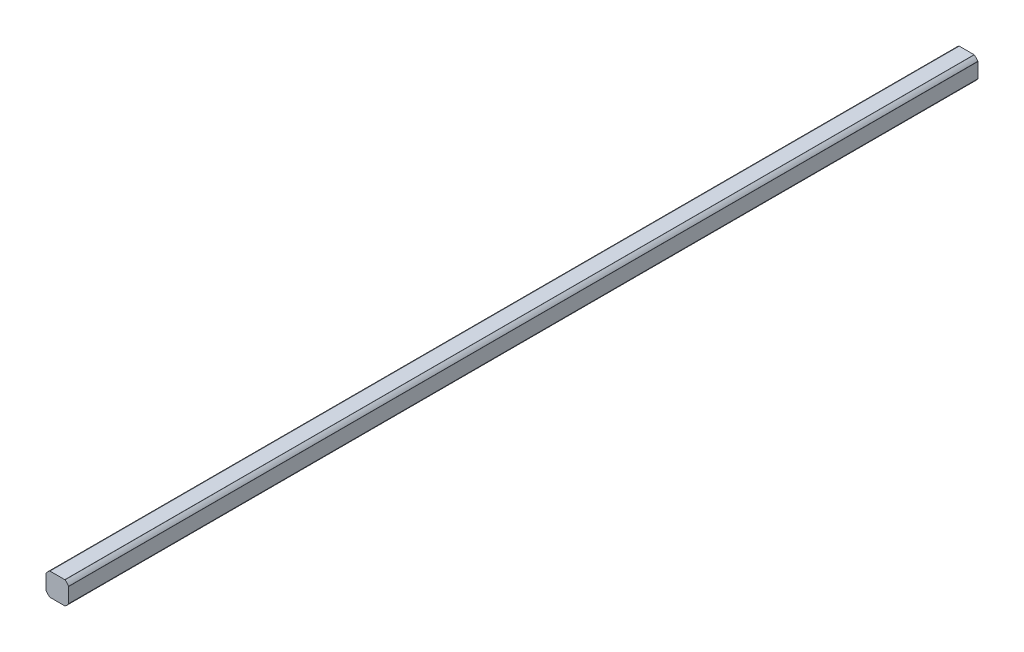
ISO-10303-21;
HEADER;
FILE_DESCRIPTION(('STEP AP214'),'2;1');
FILE_NAME('part.step','',(''),(''),'','','');
FILE_SCHEMA(('AUTOMOTIVE_DESIGN { 1 0 10303 214 1 1 1 1 }'));
ENDSEC;
DATA;
#1=APPLICATION_CONTEXT('core data for automotive mechanical design processes');
#2=APPLICATION_PROTOCOL_DEFINITION('international standard','automotive_design',2000,#1);
#3=PRODUCT_CONTEXT('',#1,'mechanical');
#4=PRODUCT('Part','Part','',(#3));
#5=PRODUCT_RELATED_PRODUCT_CATEGORY('part','',(#4));
#6=PRODUCT_DEFINITION_FORMATION('','',#4);
#7=PRODUCT_DEFINITION_CONTEXT('part definition',#1,'design');
#8=PRODUCT_DEFINITION('design','',#6,#7);
#9=PRODUCT_DEFINITION_SHAPE('','',#8);
#10=(LENGTH_UNIT() NAMED_UNIT(*) SI_UNIT(.MILLI.,.METRE.));
#11=(NAMED_UNIT(*) PLANE_ANGLE_UNIT() SI_UNIT($,.RADIAN.));
#12=(NAMED_UNIT(*) SI_UNIT($,.STERADIAN.) SOLID_ANGLE_UNIT());
#13=UNCERTAINTY_MEASURE_WITH_UNIT(LENGTH_MEASURE(1.E-05),#10,'distance_accuracy_value','');
#14=(GEOMETRIC_REPRESENTATION_CONTEXT(3) GLOBAL_UNCERTAINTY_ASSIGNED_CONTEXT((#13)) GLOBAL_UNIT_ASSIGNED_CONTEXT((#10,
#11,#12)) REPRESENTATION_CONTEXT('',''));
#15=CARTESIAN_POINT('',(0.,0.,0.));
#16=DIRECTION('',(0.,0.,1.));
#17=DIRECTION('',(1.,0.,0.));
#18=AXIS2_PLACEMENT_3D('',#15,#16,#17);
#19=CARTESIAN_POINT('',(0.,0.,304.8));
#20=DIRECTION('',(0.,0.,-1.));
#21=DIRECTION('',(-1.,0.,0.));
#22=AXIS2_PLACEMENT_3D('',#19,#20,#21);
#23=CYLINDRICAL_SURFACE('',#22,3.81);
#24=DIRECTION('',(0.,0.,1.));
#25=VECTOR('',#24,1.);
#26=CARTESIAN_POINT('',(3.15310344827586,-2.13870022314275,304.8));
#27=LINE('',#26,#25);
#28=CARTESIAN_POINT('',(3.15310344827586,-2.13870022314276,25.4));
#29=VERTEX_POINT('',#28);
#30=CARTESIAN_POINT('',(3.15310344827586,-2.13870022314276,279.4));
#31=VERTEX_POINT('',#30);
#32=EDGE_CURVE('E205',#29,#31,#27,.T.);
#33=ORIENTED_EDGE('',*,*,#32,.T.);
#34=CARTESIAN_POINT('',(0.,0.,279.4));
#35=DIRECTION('',(0.,0.,1.));
#36=DIRECTION('',(1.,0.,0.));
#37=AXIS2_PLACEMENT_3D('',#34,#35,#36);
#38=CIRCLE('',#37,3.81);
#39=CARTESIAN_POINT('',(2.13870022314276,-3.15310344827586,279.4));
#40=VERTEX_POINT('',#39);
#41=EDGE_CURVE('E180',#40,#31,#38,.T.);
#42=ORIENTED_EDGE('',*,*,#41,.F.);
#43=DIRECTION('',(0.,0.,-1.));
#44=VECTOR('',#43,1.);
#45=CARTESIAN_POINT('',(2.13870022314275,-3.15310344827586,304.8));
#46=LINE('',#45,#44);
#47=CARTESIAN_POINT('',(2.13870022314275,-3.15310344827586,25.4));
#48=VERTEX_POINT('',#47);
#49=EDGE_CURVE('E67',#40,#48,#46,.T.);
#50=ORIENTED_EDGE('',*,*,#49,.T.);
#51=CARTESIAN_POINT('',(0.,0.,25.4));
#52=DIRECTION('',(0.,0.,1.));
#53=DIRECTION('',(1.,0.,0.));
#54=AXIS2_PLACEMENT_3D('',#51,#52,#53);
#55=CIRCLE('',#54,3.81);
#56=EDGE_CURVE('E276',#48,#29,#55,.T.);
#57=ORIENTED_EDGE('',*,*,#56,.T.);
#58=EDGE_LOOP('',(#33,#42,#50,#57));
#59=FACE_BOUND('',#58,.T.);
#60=ADVANCED_FACE('F42',(#59),#23,.T.);
#61=CARTESIAN_POINT('',(3.175,2.10605674187568,304.8));
#62=DIRECTION('',(-1.,0.,0.));
#63=DIRECTION('',(0.,0.,1.));
#64=AXIS2_PLACEMENT_3D('',#61,#62,#63);
#65=PLANE('',#64);
#66=DIRECTION('',(0.,1.,0.));
#67=VECTOR('',#66,1.);
#68=CARTESIAN_POINT('',(3.175,2.10605674187568,279.4));
#69=LINE('',#68,#67);
#70=CARTESIAN_POINT('',(3.175,-2.06741021570466,279.4));
#71=VERTEX_POINT('',#70);
#72=CARTESIAN_POINT('',(3.175,2.06741021570466,279.4));
#73=VERTEX_POINT('',#72);
#74=EDGE_CURVE('E163',#71,#73,#69,.T.);
#75=ORIENTED_EDGE('',*,*,#74,.F.);
#76=DIRECTION('',(0.,0.,-1.));
#77=VECTOR('',#76,1.);
#78=CARTESIAN_POINT('',(3.175,-2.06741021570466,304.8));
#79=LINE('',#78,#77);
#80=CARTESIAN_POINT('',(3.175,-2.06741021570466,25.4));
#81=VERTEX_POINT('',#80);
#82=EDGE_CURVE('E185',#71,#81,#79,.T.);
#83=ORIENTED_EDGE('',*,*,#82,.T.);
#84=DIRECTION('',(0.,1.,0.));
#85=VECTOR('',#84,1.);
#86=CARTESIAN_POINT('',(3.175,2.10605674187568,25.4));
#87=LINE('',#86,#85);
#88=CARTESIAN_POINT('',(3.175,2.06741021570466,25.4));
#89=VERTEX_POINT('',#88);
#90=EDGE_CURVE('E287',#81,#89,#87,.T.);
#91=ORIENTED_EDGE('',*,*,#90,.T.);
#92=DIRECTION('',(0.,0.,1.));
#93=VECTOR('',#92,1.);
#94=CARTESIAN_POINT('',(3.175,2.06741021570466,304.8));
#95=LINE('',#94,#93);
#96=EDGE_CURVE('E184',#89,#73,#95,.T.);
#97=ORIENTED_EDGE('',*,*,#96,.T.);
#98=EDGE_LOOP('',(#75,#83,#91,#97));
#99=FACE_BOUND('',#98,.T.);
#100=ADVANCED_FACE('F304',(#99),#65,.F.);
#101=CARTESIAN_POINT('',(0.,0.,304.8));
#102=DIRECTION('',(0.,0.,-1.));
#103=DIRECTION('',(-1.,0.,0.));
#104=AXIS2_PLACEMENT_3D('',#101,#102,#103);
#105=CYLINDRICAL_SURFACE('',#104,3.81);
#106=DIRECTION('',(0.,0.,1.));
#107=VECTOR('',#106,1.);
#108=CARTESIAN_POINT('',(2.13870022314275,3.15310344827586,304.8));
#109=LINE('',#108,#107);
#110=CARTESIAN_POINT('',(2.13870022314276,3.15310344827586,25.4));
#111=VERTEX_POINT('',#110);
#112=CARTESIAN_POINT('',(2.13870022314276,3.15310344827586,279.4));
#113=VERTEX_POINT('',#112);
#114=EDGE_CURVE('E177',#111,#113,#109,.T.);
#115=ORIENTED_EDGE('',*,*,#114,.T.);
#116=CARTESIAN_POINT('',(3.15310344827586,2.13870022314276,279.4));
#117=VERTEX_POINT('',#116);
#118=EDGE_CURVE('E160',#117,#113,#38,.T.);
#119=ORIENTED_EDGE('',*,*,#118,.F.);
#120=DIRECTION('',(0.,0.,-1.));
#121=VECTOR('',#120,1.);
#122=CARTESIAN_POINT('',(3.15310344827586,2.13870022314275,304.8));
#123=LINE('',#122,#121);
#124=CARTESIAN_POINT('',(3.15310344827586,2.13870022314276,25.4));
#125=VERTEX_POINT('',#124);
#126=EDGE_CURVE('E174',#117,#125,#123,.T.);
#127=ORIENTED_EDGE('',*,*,#126,.T.);
#128=EDGE_CURVE('E277',#125,#111,#55,.T.);
#129=ORIENTED_EDGE('',*,*,#128,.T.);
#130=EDGE_LOOP('',(#115,#119,#127,#129));
#131=FACE_BOUND('',#130,.T.);
#132=ADVANCED_FACE('F172',(#131),#105,.T.);
#133=CARTESIAN_POINT('',(-2.10605674187568,3.175,304.8));
#134=DIRECTION('',(0.,-1.,0.));
#135=DIRECTION('',(0.,0.,-1.));
#136=AXIS2_PLACEMENT_3D('',#133,#134,#135);
#137=PLANE('',#136);
#138=DIRECTION('',(-1.,0.,0.));
#139=VECTOR('',#138,1.);
#140=CARTESIAN_POINT('',(-2.10605674187568,3.175,279.4));
#141=LINE('',#140,#139);
#142=CARTESIAN_POINT('',(2.06741021570467,3.175,279.4));
#143=VERTEX_POINT('',#142);
#144=CARTESIAN_POINT('',(-2.06741021570466,3.175,279.4));
#145=VERTEX_POINT('',#144);
#146=EDGE_CURVE('E272',#143,#145,#141,.T.);
#147=ORIENTED_EDGE('',*,*,#146,.F.);
#148=DIRECTION('',(0.,0.,-1.));
#149=VECTOR('',#148,1.);
#150=CARTESIAN_POINT('',(2.06741021570466,3.175,304.8));
#151=LINE('',#150,#149);
#152=CARTESIAN_POINT('',(2.06741021570467,3.175,25.4));
#153=VERTEX_POINT('',#152);
#154=EDGE_CURVE('E46',#143,#153,#151,.T.);
#155=ORIENTED_EDGE('',*,*,#154,.T.);
#156=DIRECTION('',(-1.,0.,0.));
#157=VECTOR('',#156,1.);
#158=CARTESIAN_POINT('',(-2.10605674187568,3.175,25.4));
#159=LINE('',#158,#157);
#160=CARTESIAN_POINT('',(-2.06741021570466,3.175,25.4));
#161=VERTEX_POINT('',#160);
#162=EDGE_CURVE('E297',#153,#161,#159,.T.);
#163=ORIENTED_EDGE('',*,*,#162,.T.);
#164=DIRECTION('',(0.,0.,1.));
#165=VECTOR('',#164,1.);
#166=CARTESIAN_POINT('',(-2.06741021570466,3.175,304.8));
#167=LINE('',#166,#165);
#168=EDGE_CURVE('E201',#161,#145,#167,.T.);
#169=ORIENTED_EDGE('',*,*,#168,.T.);
#170=EDGE_LOOP('',(#147,#155,#163,#169));
#171=FACE_BOUND('',#170,.T.);
#172=ADVANCED_FACE('F389',(#171),#137,.F.);
#173=CARTESIAN_POINT('',(0.,0.,304.8));
#174=DIRECTION('',(0.,0.,-1.));
#175=DIRECTION('',(-1.,0.,0.));
#176=AXIS2_PLACEMENT_3D('',#173,#174,#175);
#177=CYLINDRICAL_SURFACE('',#176,3.81);
#178=DIRECTION('',(0.,0.,1.));
#179=VECTOR('',#178,1.);
#180=CARTESIAN_POINT('',(-3.15310344827586,2.13870022314275,304.8));
#181=LINE('',#180,#179);
#182=CARTESIAN_POINT('',(-3.15310344827586,2.13870022314276,25.4));
#183=VERTEX_POINT('',#182);
#184=CARTESIAN_POINT('',(-3.15310344827586,2.13870022314276,279.4));
#185=VERTEX_POINT('',#184);
#186=EDGE_CURVE('E241',#183,#185,#181,.T.);
#187=ORIENTED_EDGE('',*,*,#186,.T.);
#188=CARTESIAN_POINT('',(-2.13870022314276,3.15310344827586,279.4));
#189=VERTEX_POINT('',#188);
#190=EDGE_CURVE('E178',#189,#185,#38,.T.);
#191=ORIENTED_EDGE('',*,*,#190,.F.);
#192=DIRECTION('',(0.,0.,-1.));
#193=VECTOR('',#192,1.);
#194=CARTESIAN_POINT('',(-2.13870022314275,3.15310344827586,304.8));
#195=LINE('',#194,#193);
#196=CARTESIAN_POINT('',(-2.13870022314276,3.15310344827586,25.4));
#197=VERTEX_POINT('',#196);
#198=EDGE_CURVE('E190',#189,#197,#195,.T.);
#199=ORIENTED_EDGE('',*,*,#198,.T.);
#200=EDGE_CURVE('E280',#197,#183,#55,.T.);
#201=ORIENTED_EDGE('',*,*,#200,.T.);
#202=EDGE_LOOP('',(#187,#191,#199,#201));
#203=FACE_BOUND('',#202,.T.);
#204=ADVANCED_FACE('F323',(#203),#177,.T.);
#205=CARTESIAN_POINT('',(-3.175,2.10605674187568,304.8));
#206=DIRECTION('',(1.,0.,0.));
#207=DIRECTION('',(0.,1.,0.));
#208=AXIS2_PLACEMENT_3D('',#205,#206,#207);
#209=PLANE('',#208);
#210=DIRECTION('',(0.,-1.,0.));
#211=VECTOR('',#210,1.);
#212=CARTESIAN_POINT('',(-3.175,2.10605674187568,279.4));
#213=LINE('',#212,#211);
#214=CARTESIAN_POINT('',(-3.175,2.06741021570466,279.4));
#215=VERTEX_POINT('',#214);
#216=CARTESIAN_POINT('',(-3.175,-2.06741021570466,279.4));
#217=VERTEX_POINT('',#216);
#218=EDGE_CURVE('E253',#215,#217,#213,.T.);
#219=ORIENTED_EDGE('',*,*,#218,.F.);
#220=DIRECTION('',(0.,0.,-1.));
#221=VECTOR('',#220,1.);
#222=CARTESIAN_POINT('',(-3.175,2.06741021570466,304.8));
#223=LINE('',#222,#221);
#224=CARTESIAN_POINT('',(-3.175,2.06741021570466,25.4));
#225=VERTEX_POINT('',#224);
#226=EDGE_CURVE('E240',#215,#225,#223,.T.);
#227=ORIENTED_EDGE('',*,*,#226,.T.);
#228=DIRECTION('',(0.,-1.,0.));
#229=VECTOR('',#228,1.);
#230=CARTESIAN_POINT('',(-3.175,2.10605674187568,25.4));
#231=LINE('',#230,#229);
#232=CARTESIAN_POINT('',(-3.175,-2.06741021570466,25.4));
#233=VERTEX_POINT('',#232);
#234=EDGE_CURVE('E254',#225,#233,#231,.T.);
#235=ORIENTED_EDGE('',*,*,#234,.T.);
#236=DIRECTION('',(0.,0.,1.));
#237=VECTOR('',#236,1.);
#238=CARTESIAN_POINT('',(-3.175,-2.06741021570466,304.8));
#239=LINE('',#238,#237);
#240=EDGE_CURVE('E232',#233,#217,#239,.T.);
#241=ORIENTED_EDGE('',*,*,#240,.T.);
#242=EDGE_LOOP('',(#219,#227,#235,#241));
#243=FACE_BOUND('',#242,.T.);
#244=ADVANCED_FACE('F252',(#243),#209,.F.);
#245=CARTESIAN_POINT('',(0.,0.,304.8));
#246=DIRECTION('',(0.,0.,-1.));
#247=DIRECTION('',(-1.,0.,0.));
#248=AXIS2_PLACEMENT_3D('',#245,#246,#247);
#249=CYLINDRICAL_SURFACE('',#248,3.81);
#250=DIRECTION('',(0.,0.,1.));
#251=VECTOR('',#250,1.);
#252=CARTESIAN_POINT('',(-2.13870022314275,-3.15310344827586,304.8));
#253=LINE('',#252,#251);
#254=CARTESIAN_POINT('',(-2.13870022314276,-3.15310344827586,25.4));
#255=VERTEX_POINT('',#254);
#256=CARTESIAN_POINT('',(-2.13870022314276,-3.15310344827586,279.4));
#257=VERTEX_POINT('',#256);
#258=EDGE_CURVE('E228',#255,#257,#253,.T.);
#259=ORIENTED_EDGE('',*,*,#258,.T.);
#260=CARTESIAN_POINT('',(-3.15310344827586,-2.13870022314276,279.4));
#261=VERTEX_POINT('',#260);
#262=EDGE_CURVE('E330',#261,#257,#38,.T.);
#263=ORIENTED_EDGE('',*,*,#262,.F.);
#264=DIRECTION('',(0.,0.,-1.));
#265=VECTOR('',#264,1.);
#266=CARTESIAN_POINT('',(-3.15310344827586,-2.13870022314275,304.8));
#267=LINE('',#266,#265);
#268=CARTESIAN_POINT('',(-3.15310344827586,-2.13870022314276,25.4));
#269=VERTEX_POINT('',#268);
#270=EDGE_CURVE('E231',#261,#269,#267,.T.);
#271=ORIENTED_EDGE('',*,*,#270,.T.);
#272=EDGE_CURVE('E314',#269,#255,#55,.T.);
#273=ORIENTED_EDGE('',*,*,#272,.T.);
#274=EDGE_LOOP('',(#259,#263,#271,#273));
#275=FACE_BOUND('',#274,.T.);
#276=ADVANCED_FACE('F340',(#275),#249,.T.);
#277=CARTESIAN_POINT('',(-2.10605674187568,-3.175,304.8));
#278=DIRECTION('',(0.,1.,0.));
#279=DIRECTION('',(1.,0.,0.));
#280=AXIS2_PLACEMENT_3D('',#277,#278,#279);
#281=PLANE('',#280);
#282=DIRECTION('',(1.,0.,0.));
#283=VECTOR('',#282,1.);
#284=CARTESIAN_POINT('',(-2.10605674187568,-3.175,279.4));
#285=LINE('',#284,#283);
#286=CARTESIAN_POINT('',(-2.06741021570466,-3.175,279.4));
#287=VERTEX_POINT('',#286);
#288=CARTESIAN_POINT('',(2.06741021570466,-3.175,279.4));
#289=VERTEX_POINT('',#288);
#290=EDGE_CURVE('E60',#287,#289,#285,.T.);
#291=ORIENTED_EDGE('',*,*,#290,.F.);
#292=DIRECTION('',(0.,0.,-1.));
#293=VECTOR('',#292,1.);
#294=CARTESIAN_POINT('',(-2.06741021570466,-3.175,304.8));
#295=LINE('',#294,#293);
#296=CARTESIAN_POINT('',(-2.06741021570466,-3.175,25.4));
#297=VERTEX_POINT('',#296);
#298=EDGE_CURVE('E221',#287,#297,#295,.T.);
#299=ORIENTED_EDGE('',*,*,#298,.T.);
#300=DIRECTION('',(1.,0.,0.));
#301=VECTOR('',#300,1.);
#302=CARTESIAN_POINT('',(-2.10605674187568,-3.175,25.4));
#303=LINE('',#302,#301);
#304=CARTESIAN_POINT('',(2.06741021570466,-3.175,25.4));
#305=VERTEX_POINT('',#304);
#306=EDGE_CURVE('E279',#297,#305,#303,.T.);
#307=ORIENTED_EDGE('',*,*,#306,.T.);
#308=DIRECTION('',(0.,0.,1.));
#309=VECTOR('',#308,1.);
#310=CARTESIAN_POINT('',(2.06741021570466,-3.175,304.8));
#311=LINE('',#310,#309);
#312=EDGE_CURVE('E217',#305,#289,#311,.T.);
#313=ORIENTED_EDGE('',*,*,#312,.T.);
#314=EDGE_LOOP('',(#291,#299,#307,#313));
#315=FACE_BOUND('',#314,.T.);
#316=ADVANCED_FACE('F344',(#315),#281,.F.);
#317=CARTESIAN_POINT('',(2.06741021570466,3.048,304.8));
#318=DIRECTION('',(0.,0.,-1.));
#319=DIRECTION('',(-1.,0.,0.));
#320=AXIS2_PLACEMENT_3D('',#317,#318,#319);
#321=CYLINDRICAL_SURFACE('',#320,0.127);
#322=ORIENTED_EDGE('',*,*,#154,.F.);
#323=CARTESIAN_POINT('',(2.06741021570466,3.048,279.4));
#324=DIRECTION('',(0.,0.,1.));
#325=DIRECTION('',(1.,0.,0.));
#326=AXIS2_PLACEMENT_3D('',#323,#324,#325);
#327=CIRCLE('',#326,0.127);
#328=EDGE_CURVE('E274',#143,#113,#327,.F.);
#329=ORIENTED_EDGE('',*,*,#328,.T.);
#330=ORIENTED_EDGE('',*,*,#114,.F.);
#331=CARTESIAN_POINT('',(2.06741021570466,3.048,25.4));
#332=DIRECTION('',(0.,0.,1.));
#333=DIRECTION('',(1.,0.,0.));
#334=AXIS2_PLACEMENT_3D('',#331,#332,#333);
#335=CIRCLE('',#334,0.127);
#336=EDGE_CURVE('E222',#153,#111,#335,.F.);
#337=ORIENTED_EDGE('',*,*,#336,.F.);
#338=EDGE_LOOP('',(#322,#329,#330,#337));
#339=FACE_BOUND('',#338,.T.);
#340=ADVANCED_FACE('F364',(#339),#321,.T.);
#341=CARTESIAN_POINT('',(3.048,2.06741021570466,304.8));
#342=DIRECTION('',(0.,0.,-1.));
#343=DIRECTION('',(-1.,0.,0.));
#344=AXIS2_PLACEMENT_3D('',#341,#342,#343);
#345=CYLINDRICAL_SURFACE('',#344,0.127);
#346=ORIENTED_EDGE('',*,*,#126,.F.);
#347=CARTESIAN_POINT('',(3.048,2.06741021570466,279.4));
#348=DIRECTION('',(0.,0.,1.));
#349=DIRECTION('',(1.,0.,0.));
#350=AXIS2_PLACEMENT_3D('',#347,#348,#349);
#351=CIRCLE('',#350,0.127);
#352=EDGE_CURVE('E157',#117,#73,#351,.F.);
#353=ORIENTED_EDGE('',*,*,#352,.T.);
#354=ORIENTED_EDGE('',*,*,#96,.F.);
#355=CARTESIAN_POINT('',(3.048,2.06741021570466,25.4));
#356=DIRECTION('',(0.,0.,1.));
#357=DIRECTION('',(1.,0.,0.));
#358=AXIS2_PLACEMENT_3D('',#355,#356,#357);
#359=CIRCLE('',#358,0.127);
#360=EDGE_CURVE('E183',#125,#89,#359,.F.);
#361=ORIENTED_EDGE('',*,*,#360,.F.);
#362=EDGE_LOOP('',(#346,#353,#354,#361));
#363=FACE_BOUND('',#362,.T.);
#364=ADVANCED_FACE('F182',(#363),#345,.T.);
#365=CARTESIAN_POINT('',(-2.06741021570466,3.048,304.8));
#366=DIRECTION('',(0.,0.,-1.));
#367=DIRECTION('',(-1.,0.,0.));
#368=AXIS2_PLACEMENT_3D('',#365,#366,#367);
#369=CYLINDRICAL_SURFACE('',#368,0.127);
#370=ORIENTED_EDGE('',*,*,#198,.F.);
#371=CARTESIAN_POINT('',(-2.06741021570466,3.048,279.4));
#372=DIRECTION('',(0.,0.,1.));
#373=DIRECTION('',(1.,0.,0.));
#374=AXIS2_PLACEMENT_3D('',#371,#372,#373);
#375=CIRCLE('',#374,0.127);
#376=EDGE_CURVE('E269',#189,#145,#375,.F.);
#377=ORIENTED_EDGE('',*,*,#376,.T.);
#378=ORIENTED_EDGE('',*,*,#168,.F.);
#379=CARTESIAN_POINT('',(-2.06741021570466,3.048,25.4));
#380=DIRECTION('',(0.,0.,1.));
#381=DIRECTION('',(1.,0.,0.));
#382=AXIS2_PLACEMENT_3D('',#379,#380,#381);
#383=CIRCLE('',#382,0.127);
#384=EDGE_CURVE('E295',#197,#161,#383,.F.);
#385=ORIENTED_EDGE('',*,*,#384,.F.);
#386=EDGE_LOOP('',(#370,#377,#378,#385));
#387=FACE_BOUND('',#386,.T.);
#388=ADVANCED_FACE('F44',(#387),#369,.T.);
#389=CARTESIAN_POINT('',(-3.048,2.06741021570466,304.8));
#390=DIRECTION('',(0.,0.,-1.));
#391=DIRECTION('',(-1.,0.,0.));
#392=AXIS2_PLACEMENT_3D('',#389,#390,#391);
#393=CYLINDRICAL_SURFACE('',#392,0.127);
#394=ORIENTED_EDGE('',*,*,#226,.F.);
#395=CARTESIAN_POINT('',(-3.048,2.06741021570466,279.4));
#396=DIRECTION('',(0.,0.,1.));
#397=DIRECTION('',(1.,0.,0.));
#398=AXIS2_PLACEMENT_3D('',#395,#396,#397);
#399=CIRCLE('',#398,0.127);
#400=EDGE_CURVE('E263',#215,#185,#399,.F.);
#401=ORIENTED_EDGE('',*,*,#400,.T.);
#402=ORIENTED_EDGE('',*,*,#186,.F.);
#403=CARTESIAN_POINT('',(-3.048,2.06741021570466,25.4));
#404=DIRECTION('',(0.,0.,1.));
#405=DIRECTION('',(1.,0.,0.));
#406=AXIS2_PLACEMENT_3D('',#403,#404,#405);
#407=CIRCLE('',#406,0.127);
#408=EDGE_CURVE('E293',#225,#183,#407,.F.);
#409=ORIENTED_EDGE('',*,*,#408,.F.);
#410=EDGE_LOOP('',(#394,#401,#402,#409));
#411=FACE_BOUND('',#410,.T.);
#412=ADVANCED_FACE('F329',(#411),#393,.T.);
#413=CARTESIAN_POINT('',(-3.048,-2.06741021570466,304.8));
#414=DIRECTION('',(0.,0.,-1.));
#415=DIRECTION('',(-1.,0.,0.));
#416=AXIS2_PLACEMENT_3D('',#413,#414,#415);
#417=CYLINDRICAL_SURFACE('',#416,0.127);
#418=ORIENTED_EDGE('',*,*,#270,.F.);
#419=CARTESIAN_POINT('',(-3.048,-2.06741021570466,279.4));
#420=DIRECTION('',(0.,0.,1.));
#421=DIRECTION('',(1.,0.,0.));
#422=AXIS2_PLACEMENT_3D('',#419,#420,#421);
#423=CIRCLE('',#422,0.127);
#424=EDGE_CURVE('E168',#261,#217,#423,.F.);
#425=ORIENTED_EDGE('',*,*,#424,.T.);
#426=ORIENTED_EDGE('',*,*,#240,.F.);
#427=CARTESIAN_POINT('',(-3.048,-2.06741021570466,25.4));
#428=DIRECTION('',(0.,0.,1.));
#429=DIRECTION('',(1.,0.,0.));
#430=AXIS2_PLACEMENT_3D('',#427,#428,#429);
#431=CIRCLE('',#430,0.127);
#432=EDGE_CURVE('E260',#269,#233,#431,.F.);
#433=ORIENTED_EDGE('',*,*,#432,.F.);
#434=EDGE_LOOP('',(#418,#425,#426,#433));
#435=FACE_BOUND('',#434,.T.);
#436=ADVANCED_FACE('F259',(#435),#417,.T.);
#437=CARTESIAN_POINT('',(-2.06741021570466,-3.048,304.8));
#438=DIRECTION('',(0.,0.,-1.));
#439=DIRECTION('',(-1.,0.,0.));
#440=AXIS2_PLACEMENT_3D('',#437,#438,#439);
#441=CYLINDRICAL_SURFACE('',#440,0.127);
#442=ORIENTED_EDGE('',*,*,#298,.F.);
#443=CARTESIAN_POINT('',(-2.06741021570466,-3.048,279.4));
#444=DIRECTION('',(0.,0.,1.));
#445=DIRECTION('',(1.,0.,0.));
#446=AXIS2_PLACEMENT_3D('',#443,#444,#445);
#447=CIRCLE('',#446,0.127);
#448=EDGE_CURVE('E333',#287,#257,#447,.F.);
#449=ORIENTED_EDGE('',*,*,#448,.T.);
#450=ORIENTED_EDGE('',*,*,#258,.F.);
#451=CARTESIAN_POINT('',(-2.06741021570466,-3.048,25.4));
#452=DIRECTION('',(0.,0.,1.));
#453=DIRECTION('',(1.,0.,0.));
#454=AXIS2_PLACEMENT_3D('',#451,#452,#453);
#455=CIRCLE('',#454,0.127);
#456=EDGE_CURVE('E283',#297,#255,#455,.F.);
#457=ORIENTED_EDGE('',*,*,#456,.F.);
#458=EDGE_LOOP('',(#442,#449,#450,#457));
#459=FACE_BOUND('',#458,.T.);
#460=ADVANCED_FACE('F338',(#459),#441,.T.);
#461=CARTESIAN_POINT('',(3.048,-2.06741021570466,304.8));
#462=DIRECTION('',(0.,0.,-1.));
#463=DIRECTION('',(-1.,0.,0.));
#464=AXIS2_PLACEMENT_3D('',#461,#462,#463);
#465=CYLINDRICAL_SURFACE('',#464,0.127);
#466=ORIENTED_EDGE('',*,*,#82,.F.);
#467=CARTESIAN_POINT('',(3.048,-2.06741021570466,279.4));
#468=DIRECTION('',(0.,0.,1.));
#469=DIRECTION('',(1.,0.,0.));
#470=AXIS2_PLACEMENT_3D('',#467,#468,#469);
#471=CIRCLE('',#470,0.127);
#472=EDGE_CURVE('E312',#71,#31,#471,.F.);
#473=ORIENTED_EDGE('',*,*,#472,.T.);
#474=ORIENTED_EDGE('',*,*,#32,.F.);
#475=CARTESIAN_POINT('',(3.048,-2.06741021570466,25.4));
#476=DIRECTION('',(0.,0.,1.));
#477=DIRECTION('',(1.,0.,0.));
#478=AXIS2_PLACEMENT_3D('',#475,#476,#477);
#479=CIRCLE('',#478,0.127);
#480=EDGE_CURVE('E285',#81,#29,#479,.F.);
#481=ORIENTED_EDGE('',*,*,#480,.F.);
#482=EDGE_LOOP('',(#466,#473,#474,#481));
#483=FACE_BOUND('',#482,.T.);
#484=ADVANCED_FACE('F311',(#483),#465,.T.);
#485=CARTESIAN_POINT('',(2.06741021570466,-3.048,304.8));
#486=DIRECTION('',(0.,0.,-1.));
#487=DIRECTION('',(-1.,0.,0.));
#488=AXIS2_PLACEMENT_3D('',#485,#486,#487);
#489=CYLINDRICAL_SURFACE('',#488,0.127);
#490=ORIENTED_EDGE('',*,*,#49,.F.);
#491=CARTESIAN_POINT('',(2.06741021570466,-3.048,279.4));
#492=DIRECTION('',(0.,0.,1.));
#493=DIRECTION('',(1.,0.,0.));
#494=AXIS2_PLACEMENT_3D('',#491,#492,#493);
#495=CIRCLE('',#494,0.127);
#496=EDGE_CURVE('E11',#40,#289,#495,.F.);
#497=ORIENTED_EDGE('',*,*,#496,.T.);
#498=ORIENTED_EDGE('',*,*,#312,.F.);
#499=CARTESIAN_POINT('',(2.06741021570466,-3.048,25.4));
#500=DIRECTION('',(0.,0.,1.));
#501=DIRECTION('',(1.,0.,0.));
#502=AXIS2_PLACEMENT_3D('',#499,#500,#501);
#503=CIRCLE('',#502,0.127);
#504=EDGE_CURVE('E52',#48,#305,#503,.F.);
#505=ORIENTED_EDGE('',*,*,#504,.F.);
#506=EDGE_LOOP('',(#490,#497,#498,#505));
#507=FACE_BOUND('',#506,.T.);
#508=ADVANCED_FACE('F346',(#507),#489,.T.);
#509=CARTESIAN_POINT('',(0.,0.,25.4));
#510=DIRECTION('',(0.,0.,1.));
#511=DIRECTION('',(1.,0.,0.));
#512=AXIS2_PLACEMENT_3D('',#509,#510,#511);
#513=PLANE('',#512);
#514=ORIENTED_EDGE('',*,*,#336,.T.);
#515=ORIENTED_EDGE('',*,*,#128,.F.);
#516=ORIENTED_EDGE('',*,*,#360,.T.);
#517=ORIENTED_EDGE('',*,*,#90,.F.);
#518=ORIENTED_EDGE('',*,*,#480,.T.);
#519=ORIENTED_EDGE('',*,*,#56,.F.);
#520=ORIENTED_EDGE('',*,*,#504,.T.);
#521=ORIENTED_EDGE('',*,*,#306,.F.);
#522=ORIENTED_EDGE('',*,*,#456,.T.);
#523=ORIENTED_EDGE('',*,*,#272,.F.);
#524=ORIENTED_EDGE('',*,*,#432,.T.);
#525=ORIENTED_EDGE('',*,*,#234,.F.);
#526=ORIENTED_EDGE('',*,*,#408,.T.);
#527=ORIENTED_EDGE('',*,*,#200,.F.);
#528=ORIENTED_EDGE('',*,*,#384,.T.);
#529=ORIENTED_EDGE('',*,*,#162,.F.);
#530=EDGE_LOOP('',(#514,#515,#516,#517,#518,#519,#520,#521,#522,#523,#524,#525,#526,#527,#528,#529));
#531=FACE_BOUND('',#530,.T.);
#532=ADVANCED_FACE('F309',(#531),#513,.F.);
#533=CARTESIAN_POINT('',(0.,0.,279.4));
#534=DIRECTION('',(0.,0.,1.));
#535=DIRECTION('',(1.,0.,0.));
#536=AXIS2_PLACEMENT_3D('',#533,#534,#535);
#537=PLANE('',#536);
#538=ORIENTED_EDGE('',*,*,#146,.T.);
#539=ORIENTED_EDGE('',*,*,#376,.F.);
#540=ORIENTED_EDGE('',*,*,#190,.T.);
#541=ORIENTED_EDGE('',*,*,#400,.F.);
#542=ORIENTED_EDGE('',*,*,#218,.T.);
#543=ORIENTED_EDGE('',*,*,#424,.F.);
#544=ORIENTED_EDGE('',*,*,#262,.T.);
#545=ORIENTED_EDGE('',*,*,#448,.F.);
#546=ORIENTED_EDGE('',*,*,#290,.T.);
#547=ORIENTED_EDGE('',*,*,#496,.F.);
#548=ORIENTED_EDGE('',*,*,#41,.T.);
#549=ORIENTED_EDGE('',*,*,#472,.F.);
#550=ORIENTED_EDGE('',*,*,#74,.T.);
#551=ORIENTED_EDGE('',*,*,#352,.F.);
#552=ORIENTED_EDGE('',*,*,#118,.T.);
#553=ORIENTED_EDGE('',*,*,#328,.F.);
#554=EDGE_LOOP('',(#538,#539,#540,#541,#542,#543,#544,#545,#546,#547,#548,#549,#550,#551,#552,#553));
#555=FACE_BOUND('',#554,.T.);
#556=ADVANCED_FACE('F159',(#555),#537,.T.);
#557=CLOSED_SHELL('',(#60,#100,#132,#172,#204,#244,#276,#316,#340,#364,#388,#412,#436,#460,#484,
#508,#532,#556));
#558=MANIFOLD_SOLID_BREP('B2',#557);
#559=ADVANCED_BREP_SHAPE_REPRESENTATION('',(#18,#558),#14);
#560=SHAPE_DEFINITION_REPRESENTATION(#9,#559);
ENDSEC;
END-ISO-10303-21;
